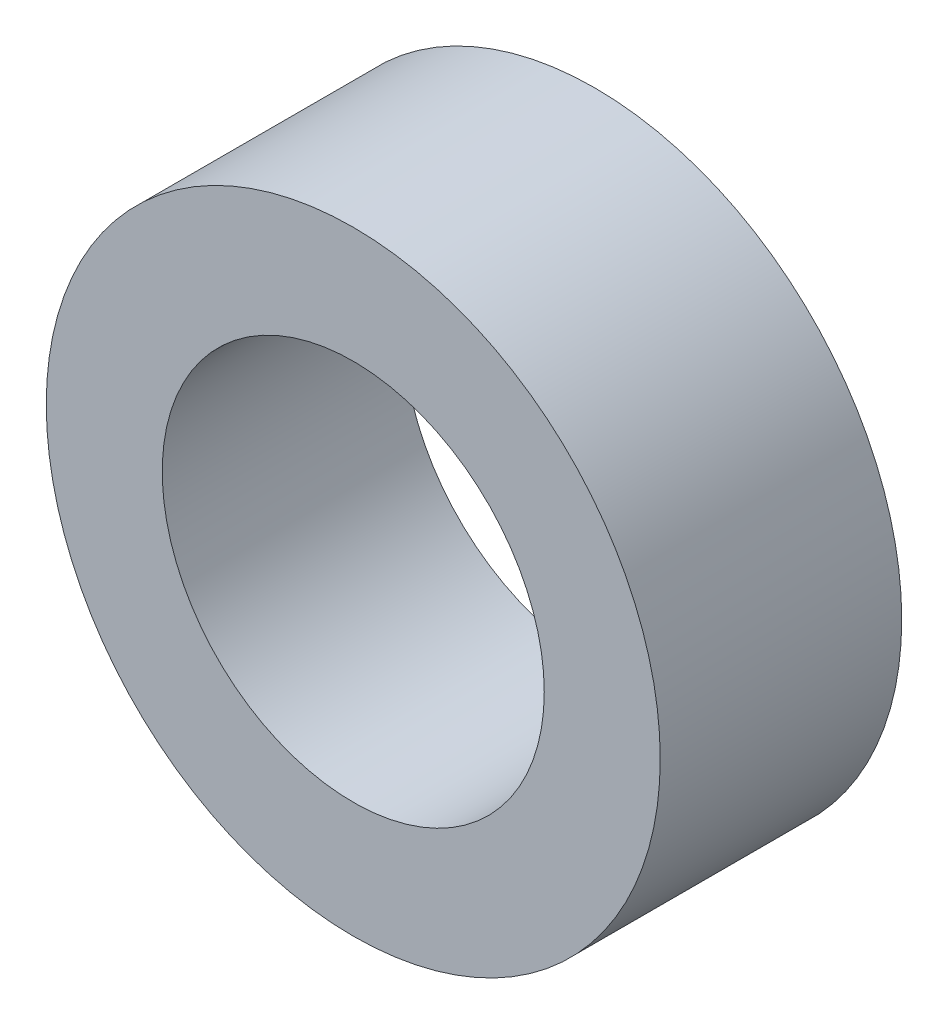
ISO-10303-21;
HEADER;
FILE_DESCRIPTION(('STEP AP214'),'2;1');
FILE_NAME('part.step','',(''),(''),'','','');
FILE_SCHEMA(('AUTOMOTIVE_DESIGN { 1 0 10303 214 1 1 1 1 }'));
ENDSEC;
DATA;
#1=APPLICATION_CONTEXT('core data for automotive mechanical design processes');
#2=APPLICATION_PROTOCOL_DEFINITION('international standard','automotive_design',2000,#1);
#3=PRODUCT_CONTEXT('',#1,'mechanical');
#4=PRODUCT('Part','Part','',(#3));
#5=PRODUCT_RELATED_PRODUCT_CATEGORY('part','',(#4));
#6=PRODUCT_DEFINITION_FORMATION('','',#4);
#7=PRODUCT_DEFINITION_CONTEXT('part definition',#1,'design');
#8=PRODUCT_DEFINITION('design','',#6,#7);
#9=PRODUCT_DEFINITION_SHAPE('','',#8);
#10=(LENGTH_UNIT() NAMED_UNIT(*) SI_UNIT(.MILLI.,.METRE.));
#11=(NAMED_UNIT(*) PLANE_ANGLE_UNIT() SI_UNIT($,.RADIAN.));
#12=(NAMED_UNIT(*) SI_UNIT($,.STERADIAN.) SOLID_ANGLE_UNIT());
#13=UNCERTAINTY_MEASURE_WITH_UNIT(LENGTH_MEASURE(1.E-05),#10,'distance_accuracy_value','');
#14=(GEOMETRIC_REPRESENTATION_CONTEXT(3) GLOBAL_UNCERTAINTY_ASSIGNED_CONTEXT((#13)) GLOBAL_UNIT_ASSIGNED_CONTEXT((#10,
#11,#12)) REPRESENTATION_CONTEXT('',''));
#15=CARTESIAN_POINT('',(0.,0.,0.));
#16=DIRECTION('',(0.,0.,1.));
#17=DIRECTION('',(1.,0.,0.));
#18=AXIS2_PLACEMENT_3D('',#15,#16,#17);
#19=CARTESIAN_POINT('',(0.,0.,17.7));
#20=DIRECTION('',(0.,0.,-1.));
#21=DIRECTION('',(-1.,0.,0.));
#22=AXIS2_PLACEMENT_3D('',#19,#20,#21);
#23=CYLINDRICAL_SURFACE('',#22,22.5);
#24=CARTESIAN_POINT('',(0.,0.,17.7));
#25=DIRECTION('',(0.,0.,1.));
#26=DIRECTION('',(1.,0.,0.));
#27=AXIS2_PLACEMENT_3D('',#24,#25,#26);
#28=CIRCLE('',#27,22.5);
#29=CARTESIAN_POINT('',(22.5,0.,17.7));
#30=VERTEX_POINT('',#29);
#31=EDGE_CURVE('E10',#30,#30,#28,.T.);
#32=ORIENTED_EDGE('',*,*,#31,.F.);
#33=EDGE_LOOP('',(#32));
#34=FACE_BOUND('',#33,.T.);
#35=CARTESIAN_POINT('',(0.,0.,0.));
#36=DIRECTION('',(0.,0.,1.));
#37=DIRECTION('',(1.,0.,0.));
#38=AXIS2_PLACEMENT_3D('',#35,#36,#37);
#39=CIRCLE('',#38,22.5);
#40=CARTESIAN_POINT('',(22.5,0.,0.));
#41=VERTEX_POINT('',#40);
#42=EDGE_CURVE('E35',#41,#41,#39,.T.);
#43=ORIENTED_EDGE('',*,*,#42,.T.);
#44=EDGE_LOOP('',(#43));
#45=FACE_BOUND('',#44,.T.);
#46=ADVANCED_FACE('F32',(#34,#45),#23,.T.);
#47=CARTESIAN_POINT('',(0.,0.,17.7));
#48=DIRECTION('',(0.,0.,1.));
#49=DIRECTION('',(1.,0.,0.));
#50=AXIS2_PLACEMENT_3D('',#47,#48,#49);
#51=PLANE('',#50);
#52=CARTESIAN_POINT('',(0.,0.,17.7));
#53=DIRECTION('',(0.,0.,1.));
#54=DIRECTION('',(1.,0.,0.));
#55=AXIS2_PLACEMENT_3D('',#52,#53,#54);
#56=CIRCLE('',#55,14.);
#57=CARTESIAN_POINT('',(14.,0.,17.7));
#58=VERTEX_POINT('',#57);
#59=EDGE_CURVE('E44',#58,#58,#56,.T.);
#60=ORIENTED_EDGE('',*,*,#59,.F.);
#61=EDGE_LOOP('',(#60));
#62=FACE_BOUND('',#61,.T.);
#63=ORIENTED_EDGE('',*,*,#31,.T.);
#64=EDGE_LOOP('',(#63));
#65=FACE_BOUND('',#64,.T.);
#66=ADVANCED_FACE('F59',(#62,#65),#51,.T.);
#67=CARTESIAN_POINT('',(0.,0.,0.));
#68=DIRECTION('',(0.,0.,1.));
#69=DIRECTION('',(1.,0.,0.));
#70=AXIS2_PLACEMENT_3D('',#67,#68,#69);
#71=PLANE('',#70);
#72=CARTESIAN_POINT('',(0.,0.,0.));
#73=DIRECTION('',(0.,0.,1.));
#74=DIRECTION('',(1.,0.,0.));
#75=AXIS2_PLACEMENT_3D('',#72,#73,#74);
#76=CIRCLE('',#75,14.);
#77=CARTESIAN_POINT('',(14.,0.,0.));
#78=VERTEX_POINT('',#77);
#79=EDGE_CURVE('E42',#78,#78,#76,.T.);
#80=ORIENTED_EDGE('',*,*,#79,.T.);
#81=EDGE_LOOP('',(#80));
#82=FACE_BOUND('',#81,.T.);
#83=ORIENTED_EDGE('',*,*,#42,.F.);
#84=EDGE_LOOP('',(#83));
#85=FACE_BOUND('',#84,.T.);
#86=ADVANCED_FACE('F50',(#82,#85),#71,.F.);
#87=CARTESIAN_POINT('',(0.,0.,0.));
#88=DIRECTION('',(0.,0.,1.));
#89=DIRECTION('',(1.,0.,0.));
#90=AXIS2_PLACEMENT_3D('',#87,#88,#89);
#91=CYLINDRICAL_SURFACE('',#90,14.);
#92=ORIENTED_EDGE('',*,*,#79,.F.);
#93=EDGE_LOOP('',(#92));
#94=FACE_BOUND('',#93,.T.);
#95=ORIENTED_EDGE('',*,*,#59,.T.);
#96=EDGE_LOOP('',(#95));
#97=FACE_BOUND('',#96,.T.);
#98=ADVANCED_FACE('F53',(#94,#97),#91,.F.);
#99=CLOSED_SHELL('',(#46,#66,#86,#98));
#100=MANIFOLD_SOLID_BREP('B2',#99);
#101=ADVANCED_BREP_SHAPE_REPRESENTATION('',(#18,#100),#14);
#102=SHAPE_DEFINITION_REPRESENTATION(#9,#101);
ENDSEC;
END-ISO-10303-21;
